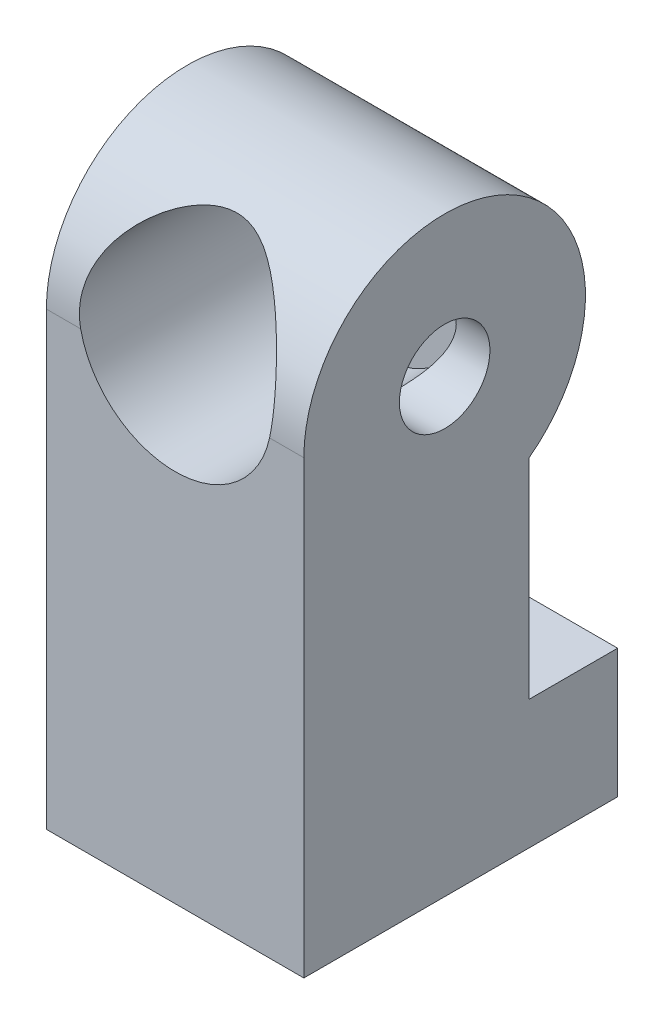
ISO-10303-21;
HEADER;
FILE_DESCRIPTION(('STEP AP214'),'2;1');
FILE_NAME('part.step','',(''),(''),'','','');
FILE_SCHEMA(('AUTOMOTIVE_DESIGN { 1 0 10303 214 1 1 1 1 }'));
ENDSEC;
DATA;
#1=APPLICATION_CONTEXT('core data for automotive mechanical design processes');
#2=APPLICATION_PROTOCOL_DEFINITION('international standard','automotive_design',2000,#1);
#3=PRODUCT_CONTEXT('',#1,'mechanical');
#4=PRODUCT('Part','Part','',(#3));
#5=PRODUCT_RELATED_PRODUCT_CATEGORY('part','',(#4));
#6=PRODUCT_DEFINITION_FORMATION('','',#4);
#7=PRODUCT_DEFINITION_CONTEXT('part definition',#1,'design');
#8=PRODUCT_DEFINITION('design','',#6,#7);
#9=PRODUCT_DEFINITION_SHAPE('','',#8);
#10=(LENGTH_UNIT() NAMED_UNIT(*) SI_UNIT(.MILLI.,.METRE.));
#11=(NAMED_UNIT(*) PLANE_ANGLE_UNIT() SI_UNIT($,.RADIAN.));
#12=(NAMED_UNIT(*) SI_UNIT($,.STERADIAN.) SOLID_ANGLE_UNIT());
#13=UNCERTAINTY_MEASURE_WITH_UNIT(LENGTH_MEASURE(1.E-05),#10,'distance_accuracy_value','');
#14=(GEOMETRIC_REPRESENTATION_CONTEXT(3) GLOBAL_UNCERTAINTY_ASSIGNED_CONTEXT((#13)) GLOBAL_UNIT_ASSIGNED_CONTEXT((#10,
#11,#12)) REPRESENTATION_CONTEXT('',''));
#15=CARTESIAN_POINT('',(0.,0.,0.));
#16=DIRECTION('',(0.,0.,1.));
#17=DIRECTION('',(1.,0.,0.));
#18=AXIS2_PLACEMENT_3D('',#15,#16,#17);
#19=CARTESIAN_POINT('',(-96.,32.,0.));
#20=DIRECTION('',(0.,0.,1.));
#21=DIRECTION('',(0.,-1.,0.));
#22=AXIS2_PLACEMENT_3D('',#19,#20,#21);
#23=PLANE('',#22);
#24=DIRECTION('',(0.,1.,0.));
#25=VECTOR('',#24,1.);
#26=CARTESIAN_POINT('',(-32.,32.,0.));
#27=LINE('',#26,#25);
#28=CARTESIAN_POINT('',(-32.,0.,0.));
#29=VERTEX_POINT('',#28);
#30=CARTESIAN_POINT('',(-32.,32.,0.));
#31=VERTEX_POINT('',#30);
#32=EDGE_CURVE('E172',#29,#31,#27,.T.);
#33=ORIENTED_EDGE('',*,*,#32,.F.);
#34=DIRECTION('',(1.,0.,0.));
#35=VECTOR('',#34,1.);
#36=CARTESIAN_POINT('',(-96.,0.,0.));
#37=LINE('',#36,#35);
#38=CARTESIAN_POINT('',(-96.,0.,0.));
#39=VERTEX_POINT('',#38);
#40=EDGE_CURVE('E186',#39,#29,#37,.T.);
#41=ORIENTED_EDGE('',*,*,#40,.F.);
#42=DIRECTION('',(0.,1.,0.));
#43=VECTOR('',#42,1.);
#44=CARTESIAN_POINT('',(-96.,32.,0.));
#45=LINE('',#44,#43);
#46=CARTESIAN_POINT('',(-96.,32.,0.));
#47=VERTEX_POINT('',#46);
#48=EDGE_CURVE('E185',#39,#47,#45,.T.);
#49=ORIENTED_EDGE('',*,*,#48,.T.);
#50=DIRECTION('',(1.,0.,0.));
#51=VECTOR('',#50,1.);
#52=CARTESIAN_POINT('',(-96.,32.,0.));
#53=LINE('',#52,#51);
#54=EDGE_CURVE('E11',#47,#31,#53,.T.);
#55=ORIENTED_EDGE('',*,*,#54,.T.);
#56=EDGE_LOOP('',(#33,#41,#49,#55));
#57=FACE_BOUND('',#56,.T.);
#58=ADVANCED_FACE('F39',(#57),#23,.F.);
#59=CARTESIAN_POINT('',(-96.,32.,22.));
#60=DIRECTION('',(0.,-1.,0.));
#61=DIRECTION('',(0.,0.,-1.));
#62=AXIS2_PLACEMENT_3D('',#59,#60,#61);
#63=PLANE('',#62);
#64=DIRECTION('',(0.,0.,1.));
#65=VECTOR('',#64,1.);
#66=CARTESIAN_POINT('',(-32.,32.,22.));
#67=LINE('',#66,#65);
#68=CARTESIAN_POINT('',(-32.,32.,22.));
#69=VERTEX_POINT('',#68);
#70=EDGE_CURVE('E161',#31,#69,#67,.T.);
#71=ORIENTED_EDGE('',*,*,#70,.F.);
#72=ORIENTED_EDGE('',*,*,#54,.F.);
#73=DIRECTION('',(0.,0.,1.));
#74=VECTOR('',#73,1.);
#75=CARTESIAN_POINT('',(-96.,32.,22.));
#76=LINE('',#75,#74);
#77=CARTESIAN_POINT('',(-96.,32.,22.));
#78=VERTEX_POINT('',#77);
#79=EDGE_CURVE('E162',#47,#78,#76,.T.);
#80=ORIENTED_EDGE('',*,*,#79,.T.);
#81=DIRECTION('',(1.,0.,0.));
#82=VECTOR('',#81,1.);
#83=CARTESIAN_POINT('',(-96.,32.,22.));
#84=LINE('',#83,#82);
#85=EDGE_CURVE('E52',#78,#69,#84,.T.);
#86=ORIENTED_EDGE('',*,*,#85,.T.);
#87=EDGE_LOOP('',(#71,#72,#80,#86));
#88=FACE_BOUND('',#87,.T.);
#89=ADVANCED_FACE('F159',(#88),#63,.F.);
#90=CARTESIAN_POINT('',(-96.,83.9999999999999,22.));
#91=DIRECTION('',(0.,0.,1.));
#92=DIRECTION('',(0.,-1.,0.));
#93=AXIS2_PLACEMENT_3D('',#90,#91,#92);
#94=PLANE('',#93);
#95=DIRECTION('',(0.,1.,0.));
#96=VECTOR('',#95,1.);
#97=CARTESIAN_POINT('',(-32.,83.9999999999999,22.));
#98=LINE('',#97,#96);
#99=CARTESIAN_POINT('',(-32.,83.9999999999999,22.));
#100=VERTEX_POINT('',#99);
#101=EDGE_CURVE('E170',#69,#100,#98,.T.);
#102=ORIENTED_EDGE('',*,*,#101,.F.);
#103=ORIENTED_EDGE('',*,*,#85,.F.);
#104=DIRECTION('',(0.,1.,0.));
#105=VECTOR('',#104,1.);
#106=CARTESIAN_POINT('',(-96.,83.9999999999999,22.));
#107=LINE('',#106,#105);
#108=CARTESIAN_POINT('',(-96.,83.9999999999999,22.));
#109=VERTEX_POINT('',#108);
#110=EDGE_CURVE('E198',#78,#109,#107,.T.);
#111=ORIENTED_EDGE('',*,*,#110,.T.);
#112=DIRECTION('',(1.,0.,0.));
#113=VECTOR('',#112,1.);
#114=CARTESIAN_POINT('',(-96.,83.9999999999999,22.));
#115=LINE('',#114,#113);
#116=EDGE_CURVE('E146',#109,#100,#115,.T.);
#117=ORIENTED_EDGE('',*,*,#116,.T.);
#118=EDGE_LOOP('',(#102,#103,#111,#117));
#119=FACE_BOUND('',#118,.T.);
#120=ADVANCED_FACE('F241',(#119),#94,.F.);
#121=CARTESIAN_POINT('',(-96.,112.,43.));
#122=DIRECTION('',(1.,0.,0.));
#123=DIRECTION('',(0.,0.,1.));
#124=AXIS2_PLACEMENT_3D('',#121,#122,#123);
#125=CYLINDRICAL_SURFACE('',#124,35.);
#126=DIRECTION('',(1.,0.,0.));
#127=VECTOR('',#126,1.);
#128=CARTESIAN_POINT('',(-96.,112.,78.));
#129=LINE('',#128,#127);
#130=CARTESIAN_POINT('',(-40.526610811389,112.,78.));
#131=VERTEX_POINT('',#130);
#132=CARTESIAN_POINT('',(-32.,112.,78.));
#133=VERTEX_POINT('',#132);
#134=EDGE_CURVE('E135',#131,#133,#129,.T.);
#135=ORIENTED_EDGE('',*,*,#134,.T.);
#136=CARTESIAN_POINT('',(-32.,112.,43.));
#137=DIRECTION('',(1.,0.,0.));
#138=DIRECTION('',(0.,0.,-1.));
#139=AXIS2_PLACEMENT_3D('',#136,#137,#138);
#140=CIRCLE('',#139,35.);
#141=EDGE_CURVE('E174',#100,#133,#140,.T.);
#142=ORIENTED_EDGE('',*,*,#141,.F.);
#143=ORIENTED_EDGE('',*,*,#116,.F.);
#144=CARTESIAN_POINT('',(-96.,112.,43.));
#145=DIRECTION('',(1.,0.,0.));
#146=DIRECTION('',(0.,0.,-1.));
#147=AXIS2_PLACEMENT_3D('',#144,#145,#146);
#148=CIRCLE('',#147,35.);
#149=CARTESIAN_POINT('',(-96.,112.,78.));
#150=VERTEX_POINT('',#149);
#151=EDGE_CURVE('E145',#109,#150,#148,.T.);
#152=ORIENTED_EDGE('',*,*,#151,.T.);
#153=CARTESIAN_POINT('',(-87.473389188611,112.,78.));
#154=VERTEX_POINT('',#153);
#155=EDGE_CURVE('E132',#150,#154,#129,.T.);
#156=ORIENTED_EDGE('',*,*,#155,.T.);
#157=CARTESIAN_POINT('',(-40.526610811389,112.,78.));
#158=CARTESIAN_POINT('',(-40.4657372784238,112.285770960589,78.0000033038681));
#159=CARTESIAN_POINT('',(-40.4100954867292,112.5726193664,77.9964988963329));
#160=CARTESIAN_POINT('',(-40.3093425981942,113.147980595281,77.9823517356442));
#161=CARTESIAN_POINT('',(-40.2642313709705,113.436493397699,77.9717090708787));
#162=CARTESIAN_POINT('',(-40.1448318755622,114.303515876569,77.9289033771368));
#163=CARTESIAN_POINT('',(-40.0864171322367,114.883794772241,77.8858628929673));
#164=CARTESIAN_POINT('',(-40.0121992504889,116.040907567426,77.7707843532183));
#165=CARTESIAN_POINT('',(-39.9961661951566,116.617743046204,77.6989052047706));
#166=CARTESIAN_POINT('',(-40.0053741544142,117.766797193259,77.5265332121475));
#167=CARTESIAN_POINT('',(-40.0306153202229,118.339015844612,77.4260402631392));
#168=CARTESIAN_POINT('',(-40.1210935752478,119.474255506463,77.1975237261499));
#169=CARTESIAN_POINT('',(-40.1863031680125,120.037282567213,77.0695191042202));
#170=CARTESIAN_POINT('',(-40.3549941694054,121.151009412165,76.7874084626899));
#171=CARTESIAN_POINT('',(-40.4584792312914,121.701708014336,76.633299952327));
#172=CARTESIAN_POINT('',(-40.6408771360302,122.516248586096,76.3839691258425));
#173=CARTESIAN_POINT('',(-40.7062520129752,122.786001926171,76.2977739075156));
#174=CARTESIAN_POINT('',(-40.8457653383859,123.321223515012,76.1196227842082));
#175=CARTESIAN_POINT('',(-40.9199014077309,123.586692904939,76.0276684463025));
#176=CARTESIAN_POINT('',(-41.1550726165188,124.376377774185,75.7435209405201));
#177=CARTESIAN_POINT('',(-41.3288741102407,124.893884826216,75.5430387086922));
#178=CARTESIAN_POINT('',(-41.7187816109087,125.937267228196,75.1105786862499));
#179=CARTESIAN_POINT('',(-41.9367138872053,126.461983388682,74.8774649639629));
#180=CARTESIAN_POINT('',(-42.4052638440613,127.487379798758,74.3920825661714));
#181=CARTESIAN_POINT('',(-42.6558825982168,127.988059258118,74.1398132616106));
#182=CARTESIAN_POINT('',(-43.1874007239557,128.96430966045,73.6189220126708));
#183=CARTESIAN_POINT('',(-43.4683065287994,129.439875236908,73.3502965993925));
#184=CARTESIAN_POINT('',(-44.0582026419268,130.365095991676,72.7995499119513));
#185=CARTESIAN_POINT('',(-44.367196680949,130.814747715056,72.517426847366));
#186=CARTESIAN_POINT('',(-45.0769932392409,131.776539777435,71.8839756846293));
#187=CARTESIAN_POINT('',(-45.483680401591,132.282767496524,71.5302507278996));
#188=CARTESIAN_POINT('',(-46.3325138297209,133.256607895729,70.8122757689805));
#189=CARTESIAN_POINT('',(-46.774665724245,133.724214422128,70.4480241019484));
#190=CARTESIAN_POINT('',(-47.6932326691756,134.621064184179,69.7137360772324));
#191=CARTESIAN_POINT('',(-48.1696892860173,135.050259416332,69.3436931419473));
#192=CARTESIAN_POINT('',(-49.1554468038176,135.869284514985,68.6039381547479));
#193=CARTESIAN_POINT('',(-49.6647440681305,136.259118727945,68.2342260707776));
#194=CARTESIAN_POINT('',(-50.6789248567714,136.972621388621,67.5275778642149));
#195=CARTESIAN_POINT('',(-51.1815613925863,137.29902133158,67.1901763352173));
#196=CARTESIAN_POINT('',(-52.2159222054699,137.916463461873,66.5274736222862));
#197=CARTESIAN_POINT('',(-52.7476515437851,138.20749946843,66.20217456045));
#198=CARTESIAN_POINT('',(-53.8404443557964,138.752136982544,65.5720202239907));
#199=CARTESIAN_POINT('',(-54.4014579451167,139.005799506232,65.2671320806778));
#200=CARTESIAN_POINT('',(-55.2660787074933,139.356547270904,64.8324101920279));
#201=CARTESIAN_POINT('',(-55.5580734989057,139.468485631767,64.691297882064));
#202=CARTESIAN_POINT('',(-56.1500208382346,139.682082580426,64.4180378337826));
#203=CARTESIAN_POINT('',(-56.4499749914042,139.783739074363,64.2858919232302));
#204=CARTESIAN_POINT('',(-57.1383054925486,140.001733104963,63.9986545453286));
#205=CARTESIAN_POINT('',(-57.5290609155852,140.114828666823,63.8467547918406));
#206=CARTESIAN_POINT('',(-58.3227618099813,140.322460110087,63.5637805282619));
#207=CARTESIAN_POINT('',(-58.725703087113,140.417002295297,63.4326989477616));
#208=CARTESIAN_POINT('',(-59.5422707526879,140.586057898427,63.1955071240069));
#209=CARTESIAN_POINT('',(-59.9558771060737,140.660606243383,63.0893533754916));
#210=CARTESIAN_POINT('',(-60.7926945485433,140.788490554708,62.9056622776807));
#211=CARTESIAN_POINT('',(-61.2159054669494,140.841826897714,62.8281244202894));
#212=CARTESIAN_POINT('',(-62.0738991132862,140.926510726852,62.7043833440177));
#213=CARTESIAN_POINT('',(-62.5087577358442,140.957611765854,62.6585315007774));
#214=CARTESIAN_POINT('',(-63.3818048857427,140.996014519876,62.6018454756325));
#215=CARTESIAN_POINT('',(-63.8199931944765,141.003317784008,62.5910090144081));
#216=CARTESIAN_POINT('',(-64.6956402729745,140.99391257502,62.6049253497456));
#217=CARTESIAN_POINT('',(-65.1330988510211,140.977198559646,62.6296863608181));
#218=CARTESIAN_POINT('',(-66.0031545130957,140.920232633042,62.7135145958411));
#219=CARTESIAN_POINT('',(-66.4357510175502,140.879977945398,62.7725858663779));
#220=CARTESIAN_POINT('',(-67.332186578583,140.772225362011,62.9290956909359));
#221=CARTESIAN_POINT('',(-67.7952304203971,140.702558517586,63.0295686153942));
#222=CARTESIAN_POINT('',(-68.7084054317072,140.538188484801,63.2630719360726));
#223=CARTESIAN_POINT('',(-69.1585346393955,140.443481514789,63.3961072497592));
#224=CARTESIAN_POINT('',(-70.0451623198209,140.230678101119,63.6896522272234));
#225=CARTESIAN_POINT('',(-70.4816265313219,140.112527589649,63.8502252828761));
#226=CARTESIAN_POINT('',(-71.3393193493604,139.854650429306,64.1935017709339));
#227=CARTESIAN_POINT('',(-71.760542061645,139.714915541017,64.3762136486396));
#228=CARTESIAN_POINT('',(-72.4983285470345,139.447658815825,64.7177897269317));
#229=CARTESIAN_POINT('',(-72.8178715531162,139.324002553949,64.8732985801746));
#230=CARTESIAN_POINT('',(-73.447519774892,139.064909120625,65.1930864183557));
#231=CARTESIAN_POINT('',(-73.7576271200682,138.929474634362,65.3573634010649));
#232=CARTESIAN_POINT('',(-74.674572733812,138.505982825757,65.8609913881334));
#233=CARTESIAN_POINT('',(-75.2677626094386,138.200836585416,66.2110103800378));
#234=CARTESIAN_POINT('',(-76.4196710003238,137.547283009352,66.9284860072909));
#235=CARTESIAN_POINT('',(-76.9783441636001,137.19882049637,67.2959645073313));
#236=CARTESIAN_POINT('',(-78.0614134952924,136.46037144984,68.0392628190313));
#237=CARTESIAN_POINT('',(-78.5858160594052,136.070392700114,68.4150810566626));
#238=CARTESIAN_POINT('',(-79.6284891559248,135.227020668909,69.1887524129456));
#239=CARTESIAN_POINT('',(-80.1448388827189,134.771320166758,69.5866814386049));
#240=CARTESIAN_POINT('',(-81.138747156398,133.814846148549,70.3769523658219));
#241=CARTESIAN_POINT('',(-81.6163013968348,133.31406764163,70.7692936431425));
#242=CARTESIAN_POINT('',(-82.5299365302564,132.268356030928,71.5414694722964));
#243=CARTESIAN_POINT('',(-82.9660710341274,131.723481742473,71.9213197632747));
#244=CARTESIAN_POINT('',(-83.5871022200298,130.873303088104,72.4773333434011));
#245=CARTESIAN_POINT('',(-83.7885753251226,130.584446965526,72.6603691174928));
#246=CARTESIAN_POINT('',(-84.1800718120861,129.995757059943,73.0211914641386));
#247=CARTESIAN_POINT('',(-84.3700922763467,129.69592051064,73.1989766932598));
#248=CARTESIAN_POINT('',(-84.863517109877,128.877407023356,73.667618227553));
#249=CARTESIAN_POINT('',(-85.1559380025174,128.348848524768,73.9529605442081));
#250=CARTESIAN_POINT('',(-85.7036715809497,127.262580543549,74.5027641915182));
#251=CARTESIAN_POINT('',(-85.9589915637228,126.704876822597,74.7672296235381));
#252=CARTESIAN_POINT('',(-86.4293197889321,125.56197335087,75.2717052619744));
#253=CARTESIAN_POINT('',(-86.6443280614472,124.97677362061,75.5117154866381));
#254=CARTESIAN_POINT('',(-87.0305278996039,123.781530243429,75.9636721775861));
#255=CARTESIAN_POINT('',(-87.2017205543213,123.171487214446,76.1756193413392));
#256=CARTESIAN_POINT('',(-87.4981658192128,121.924487052425,76.5698666708576));
#257=CARTESIAN_POINT('',(-87.6229869622794,121.287335765034,76.7518800192127));
#258=CARTESIAN_POINT('',(-87.8212183126255,119.996027867703,77.080894813519));
#259=CARTESIAN_POINT('',(-87.8946213439663,119.341868897368,77.2278913706199));
#260=CARTESIAN_POINT('',(-87.9872475998921,118.023636644477,77.4842855905155));
#261=CARTESIAN_POINT('',(-88.006566661784,117.359582998009,77.5937494590501));
#262=CARTESIAN_POINT('',(-87.9895161648737,116.027200903242,77.774026119515));
#263=CARTESIAN_POINT('',(-87.9531837011113,115.358875597896,77.8448646148769));
#264=CARTESIAN_POINT('',(-87.8669590475495,114.466247883746,77.9137385262532));
#265=CARTESIAN_POINT('',(-87.8419218941916,114.240577618303,77.9289399760838));
#266=CARTESIAN_POINT('',(-87.7854236388511,113.789836340084,77.9549334380612));
#267=CARTESIAN_POINT('',(-87.7539644501736,113.564765169005,77.9657267606462));
#268=CARTESIAN_POINT('',(-87.6846878989832,113.11579063128,77.9829302721798));
#269=CARTESIAN_POINT('',(-87.6468802493292,112.891886011397,77.9893470822089));
#270=CARTESIAN_POINT('',(-87.5648993582725,112.445096829355,77.9978837310614));
#271=CARTESIAN_POINT('',(-87.5207243093025,112.222212575456,78.0000023471372));
#272=CARTESIAN_POINT('',(-87.473389188611,112.,78.));
#273=B_SPLINE_CURVE_WITH_KNOTS('',3,(#157,#158,#159,#160,#161,#162,#163,#164,#165,#166,#167,
#168,#169,#170,#171,#172,#173,#174,#175,#176,#177,#178,#179,#180,#181,#182,#183,#184,#185,#186,
#187,#188,#189,#190,#191,#192,#193,#194,#195,#196,#197,#198,#199,#200,#201,#202,#203,#204,#205,
#206,#207,#208,#209,#210,#211,#212,#213,#214,#215,#216,#217,#218,#219,#220,#221,#222,#223,#224,
#225,#226,#227,#228,#229,#230,#231,#232,#233,#234,#235,#236,#237,#238,#239,#240,#241,#242,#243,
#244,#245,#246,#247,#248,#249,#250,#251,#252,#253,#254,#255,#256,#257,#258,#259,#260,#261,#262,
#263,#264,#265,#266,#267,#268,#269,#270,#271,#272),.UNSPECIFIED.,.F.,.F.,(4,2,2,2,2,2,2,2,2,2,2,
2,2,2,2,2,2,2,2,2,2,2,2,2,2,2,2,2,2,2,2,2,2,2,2,2,2,2,2,2,2,2,2,2,2,2,2,2,2,2,2,2,2,2,2,2,2,4),
(0.,0.876403966798758,1.7527970819047,3.50471179155132,5.24710282627611,6.98950024471845,
8.73070031669074,10.4720666229363,11.3437919347099,12.2152810691987,13.9582117154247,
15.7989189333481,17.6396866250204,19.4808460865825,21.3222504531546,23.5385022533195,
25.7551065020237,27.9744433000831,30.1935347580644,32.2552997633313,34.317424599445,
36.3761445802565,37.4050830114413,38.4342305614219,39.7359347299754,41.0371958551063,
42.3361687916078,43.6351186627954,44.9482513076796,46.2612984727175,47.5746486865534,
48.8881538296864,50.3227193215866,51.7575015907295,53.1956321853617,54.6343131213943,
55.7627137920535,56.8908578823379,59.1480937944034,61.4082350700789,63.6679533387697,
66.051857854531,68.4360266323193,70.8170662016702,72.0074718786877,73.1981795459368,
75.2003632863393,77.2021527040928,79.2039406281991,81.205678791273,83.225601604364,
85.245806262813,87.2624288266118,89.2777077767934,89.9603102167158,90.6427095861677,
91.3240742725771,92.0056327660513),.UNSPECIFIED.);
#274=EDGE_CURVE('E138',#131,#154,#273,.T.);
#275=ORIENTED_EDGE('',*,*,#274,.F.);
#276=EDGE_LOOP('',(#135,#142,#143,#152,#156,#275));
#277=FACE_BOUND('',#276,.T.);
#278=ADVANCED_FACE('F143',(#277),#125,.T.);
#279=CARTESIAN_POINT('',(-96.,0.,78.));
#280=DIRECTION('',(0.,0.,-1.));
#281=DIRECTION('',(1.,0.,0.));
#282=AXIS2_PLACEMENT_3D('',#279,#280,#281);
#283=PLANE('',#282);
#284=ORIENTED_EDGE('',*,*,#155,.F.);
#285=DIRECTION('',(0.,-1.,0.));
#286=VECTOR('',#285,1.);
#287=CARTESIAN_POINT('',(-96.,0.,78.));
#288=LINE('',#287,#286);
#289=CARTESIAN_POINT('',(-96.,0.,78.));
#290=VERTEX_POINT('',#289);
#291=EDGE_CURVE('E192',#150,#290,#288,.T.);
#292=ORIENTED_EDGE('',*,*,#291,.T.);
#293=DIRECTION('',(1.,0.,0.));
#294=VECTOR('',#293,1.);
#295=CARTESIAN_POINT('',(-96.,0.,78.));
#296=LINE('',#295,#294);
#297=CARTESIAN_POINT('',(-32.,0.,78.));
#298=VERTEX_POINT('',#297);
#299=EDGE_CURVE('E150',#290,#298,#296,.T.);
#300=ORIENTED_EDGE('',*,*,#299,.T.);
#301=DIRECTION('',(0.,-1.,0.));
#302=VECTOR('',#301,1.);
#303=CARTESIAN_POINT('',(-32.,0.,78.));
#304=LINE('',#303,#302);
#305=EDGE_CURVE('E181',#133,#298,#304,.T.);
#306=ORIENTED_EDGE('',*,*,#305,.F.);
#307=ORIENTED_EDGE('',*,*,#134,.F.);
#308=CARTESIAN_POINT('',(-64.,117.,78.));
#309=DIRECTION('',(0.,0.,-1.));
#310=DIRECTION('',(-1.,0.,0.));
#311=AXIS2_PLACEMENT_3D('',#308,#309,#310);
#312=CIRCLE('',#311,24.);
#313=EDGE_CURVE('E58',#131,#154,#312,.T.);
#314=ORIENTED_EDGE('',*,*,#313,.T.);
#315=EDGE_LOOP('',(#284,#292,#300,#306,#307,#314));
#316=FACE_BOUND('',#315,.T.);
#317=ADVANCED_FACE('F129',(#316),#283,.F.);
#318=CARTESIAN_POINT('',(-96.,0.,0.));
#319=DIRECTION('',(0.,1.,0.));
#320=DIRECTION('',(0.,0.,1.));
#321=AXIS2_PLACEMENT_3D('',#318,#319,#320);
#322=PLANE('',#321);
#323=DIRECTION('',(1.,0.,0.));
#324=VECTOR('',#323,1.);
#325=CARTESIAN_POINT('',(-40.,0.,64.));
#326=LINE('',#325,#324);
#327=CARTESIAN_POINT('',(-88.,0.,64.));
#328=VERTEX_POINT('',#327);
#329=CARTESIAN_POINT('',(-40.,0.,64.));
#330=VERTEX_POINT('',#329);
#331=EDGE_CURVE('E217',#328,#330,#326,.T.);
#332=ORIENTED_EDGE('',*,*,#331,.T.);
#333=DIRECTION('',(0.,0.,-1.));
#334=VECTOR('',#333,1.);
#335=CARTESIAN_POINT('',(-40.,0.,31.));
#336=LINE('',#335,#334);
#337=CARTESIAN_POINT('',(-40.,0.,31.));
#338=VERTEX_POINT('',#337);
#339=EDGE_CURVE('E214',#330,#338,#336,.T.);
#340=ORIENTED_EDGE('',*,*,#339,.T.);
#341=DIRECTION('',(-1.,0.,0.));
#342=VECTOR('',#341,1.);
#343=CARTESIAN_POINT('',(-40.,0.,31.));
#344=LINE('',#343,#342);
#345=CARTESIAN_POINT('',(-88.,0.,31.));
#346=VERTEX_POINT('',#345);
#347=EDGE_CURVE('E210',#338,#346,#344,.T.);
#348=ORIENTED_EDGE('',*,*,#347,.T.);
#349=DIRECTION('',(0.,0.,1.));
#350=VECTOR('',#349,1.);
#351=CARTESIAN_POINT('',(-88.,0.,31.));
#352=LINE('',#351,#350);
#353=EDGE_CURVE('E220',#346,#328,#352,.T.);
#354=ORIENTED_EDGE('',*,*,#353,.T.);
#355=EDGE_LOOP('',(#332,#340,#348,#354));
#356=FACE_BOUND('',#355,.T.);
#357=DIRECTION('',(0.,0.,-1.));
#358=VECTOR('',#357,1.);
#359=CARTESIAN_POINT('',(-32.,0.,0.));
#360=LINE('',#359,#358);
#361=EDGE_CURVE('E184',#298,#29,#360,.T.);
#362=ORIENTED_EDGE('',*,*,#361,.F.);
#363=ORIENTED_EDGE('',*,*,#299,.F.);
#364=DIRECTION('',(0.,0.,-1.));
#365=VECTOR('',#364,1.);
#366=CARTESIAN_POINT('',(-96.,0.,0.));
#367=LINE('',#366,#365);
#368=EDGE_CURVE('E188',#290,#39,#367,.T.);
#369=ORIENTED_EDGE('',*,*,#368,.T.);
#370=ORIENTED_EDGE('',*,*,#40,.T.);
#371=EDGE_LOOP('',(#362,#363,#369,#370));
#372=FACE_BOUND('',#371,.T.);
#373=ADVANCED_FACE('F253',(#356,#372),#322,.F.);
#374=CARTESIAN_POINT('',(-96.,112.,43.));
#375=DIRECTION('',(-1.,0.,0.));
#376=DIRECTION('',(0.,0.,-1.));
#377=AXIS2_PLACEMENT_3D('',#374,#375,#376);
#378=PLANE('',#377);
#379=ORIENTED_EDGE('',*,*,#48,.F.);
#380=ORIENTED_EDGE('',*,*,#368,.F.);
#381=ORIENTED_EDGE('',*,*,#291,.F.);
#382=ORIENTED_EDGE('',*,*,#151,.F.);
#383=ORIENTED_EDGE('',*,*,#110,.F.);
#384=ORIENTED_EDGE('',*,*,#79,.F.);
#385=EDGE_LOOP('',(#379,#380,#381,#382,#383,#384));
#386=FACE_BOUND('',#385,.T.);
#387=ADVANCED_FACE('F252',(#386),#378,.T.);
#388=CARTESIAN_POINT('',(-32.,112.,43.));
#389=DIRECTION('',(-1.,0.,0.));
#390=DIRECTION('',(0.,0.,-1.));
#391=AXIS2_PLACEMENT_3D('',#388,#389,#390);
#392=PLANE('',#391);
#393=CARTESIAN_POINT('',(-32.,112.,43.));
#394=DIRECTION('',(-1.,0.,0.));
#395=DIRECTION('',(0.,0.,1.));
#396=AXIS2_PLACEMENT_3D('',#393,#394,#395);
#397=CIRCLE('',#396,11.25);
#398=CARTESIAN_POINT('',(-32.,112.,54.25));
#399=VERTEX_POINT('',#398);
#400=EDGE_CURVE('E141',#399,#399,#397,.T.);
#401=ORIENTED_EDGE('',*,*,#400,.T.);
#402=EDGE_LOOP('',(#401));
#403=FACE_BOUND('',#402,.T.);
#404=ORIENTED_EDGE('',*,*,#32,.T.);
#405=ORIENTED_EDGE('',*,*,#70,.T.);
#406=ORIENTED_EDGE('',*,*,#101,.T.);
#407=ORIENTED_EDGE('',*,*,#141,.T.);
#408=ORIENTED_EDGE('',*,*,#305,.T.);
#409=ORIENTED_EDGE('',*,*,#361,.T.);
#410=EDGE_LOOP('',(#404,#405,#406,#407,#408,#409));
#411=FACE_BOUND('',#410,.T.);
#412=ADVANCED_FACE('F168',(#403,#411),#392,.F.);
#413=CARTESIAN_POINT('',(-88.,89.,31.));
#414=DIRECTION('',(-1.,0.,0.));
#415=DIRECTION('',(0.,0.,-1.));
#416=AXIS2_PLACEMENT_3D('',#413,#414,#415);
#417=PLANE('',#416);
#418=ORIENTED_EDGE('',*,*,#353,.F.);
#419=DIRECTION('',(0.,-1.,0.));
#420=VECTOR('',#419,1.);
#421=CARTESIAN_POINT('',(-88.,89.,31.));
#422=LINE('',#421,#420);
#423=CARTESIAN_POINT('',(-88.,89.,31.));
#424=VERTEX_POINT('',#423);
#425=EDGE_CURVE('E176',#424,#346,#422,.T.);
#426=ORIENTED_EDGE('',*,*,#425,.F.);
#427=DIRECTION('',(0.,0.,1.));
#428=VECTOR('',#427,1.);
#429=CARTESIAN_POINT('',(-88.,89.,31.));
#430=LINE('',#429,#428);
#431=CARTESIAN_POINT('',(-88.,89.,64.));
#432=VERTEX_POINT('',#431);
#433=EDGE_CURVE('E213',#424,#432,#430,.T.);
#434=ORIENTED_EDGE('',*,*,#433,.T.);
#435=DIRECTION('',(0.,-1.,0.));
#436=VECTOR('',#435,1.);
#437=CARTESIAN_POINT('',(-88.,89.,64.));
#438=LINE('',#437,#436);
#439=EDGE_CURVE('E66',#432,#328,#438,.T.);
#440=ORIENTED_EDGE('',*,*,#439,.T.);
#441=EDGE_LOOP('',(#418,#426,#434,#440));
#442=FACE_BOUND('',#441,.T.);
#443=ADVANCED_FACE('F263',(#442),#417,.F.);
#444=CARTESIAN_POINT('',(-40.,89.,31.));
#445=DIRECTION('',(0.,0.,-1.));
#446=DIRECTION('',(1.,0.,0.));
#447=AXIS2_PLACEMENT_3D('',#444,#445,#446);
#448=PLANE('',#447);
#449=ORIENTED_EDGE('',*,*,#347,.F.);
#450=DIRECTION('',(0.,-1.,0.));
#451=VECTOR('',#450,1.);
#452=CARTESIAN_POINT('',(-40.,89.,31.));
#453=LINE('',#452,#451);
#454=CARTESIAN_POINT('',(-40.,89.,31.));
#455=VERTEX_POINT('',#454);
#456=EDGE_CURVE('E207',#455,#338,#453,.T.);
#457=ORIENTED_EDGE('',*,*,#456,.F.);
#458=DIRECTION('',(-1.,0.,0.));
#459=VECTOR('',#458,1.);
#460=CARTESIAN_POINT('',(-40.,89.,31.));
#461=LINE('',#460,#459);
#462=EDGE_CURVE('E205',#455,#424,#461,.T.);
#463=ORIENTED_EDGE('',*,*,#462,.T.);
#464=ORIENTED_EDGE('',*,*,#425,.T.);
#465=EDGE_LOOP('',(#449,#457,#463,#464));
#466=FACE_BOUND('',#465,.T.);
#467=ADVANCED_FACE('F268',(#466),#448,.F.);
#468=CARTESIAN_POINT('',(-40.,89.,31.));
#469=DIRECTION('',(1.,0.,0.));
#470=DIRECTION('',(0.,0.,1.));
#471=AXIS2_PLACEMENT_3D('',#468,#469,#470);
#472=PLANE('',#471);
#473=ORIENTED_EDGE('',*,*,#339,.F.);
#474=DIRECTION('',(0.,-1.,0.));
#475=VECTOR('',#474,1.);
#476=CARTESIAN_POINT('',(-40.,89.,64.));
#477=LINE('',#476,#475);
#478=CARTESIAN_POINT('',(-40.,89.,64.));
#479=VERTEX_POINT('',#478);
#480=EDGE_CURVE('E204',#479,#330,#477,.T.);
#481=ORIENTED_EDGE('',*,*,#480,.F.);
#482=DIRECTION('',(0.,0.,-1.));
#483=VECTOR('',#482,1.);
#484=CARTESIAN_POINT('',(-40.,89.,31.));
#485=LINE('',#484,#483);
#486=EDGE_CURVE('E223',#479,#455,#485,.T.);
#487=ORIENTED_EDGE('',*,*,#486,.T.);
#488=ORIENTED_EDGE('',*,*,#456,.T.);
#489=EDGE_LOOP('',(#473,#481,#487,#488));
#490=FACE_BOUND('',#489,.T.);
#491=ADVANCED_FACE('F273',(#490),#472,.F.);
#492=CARTESIAN_POINT('',(-40.,89.,64.));
#493=DIRECTION('',(0.,0.,1.));
#494=DIRECTION('',(-1.,0.,0.));
#495=AXIS2_PLACEMENT_3D('',#492,#493,#494);
#496=PLANE('',#495);
#497=ORIENTED_EDGE('',*,*,#331,.F.);
#498=ORIENTED_EDGE('',*,*,#439,.F.);
#499=DIRECTION('',(1.,0.,0.));
#500=VECTOR('',#499,1.);
#501=CARTESIAN_POINT('',(-40.,89.,64.));
#502=LINE('',#501,#500);
#503=EDGE_CURVE('E225',#432,#479,#502,.T.);
#504=ORIENTED_EDGE('',*,*,#503,.T.);
#505=ORIENTED_EDGE('',*,*,#480,.T.);
#506=EDGE_LOOP('',(#497,#498,#504,#505));
#507=FACE_BOUND('',#506,.T.);
#508=ADVANCED_FACE('F269',(#507),#496,.F.);
#509=CARTESIAN_POINT('',(-64.,89.,0.));
#510=DIRECTION('',(0.,1.,0.));
#511=DIRECTION('',(0.,0.,1.));
#512=AXIS2_PLACEMENT_3D('',#509,#510,#511);
#513=PLANE('',#512);
#514=ORIENTED_EDGE('',*,*,#433,.F.);
#515=ORIENTED_EDGE('',*,*,#462,.F.);
#516=ORIENTED_EDGE('',*,*,#486,.F.);
#517=ORIENTED_EDGE('',*,*,#503,.F.);
#518=EDGE_LOOP('',(#514,#515,#516,#517));
#519=FACE_BOUND('',#518,.T.);
#520=ADVANCED_FACE('F272',(#519),#513,.F.);
#521=CARTESIAN_POINT('',(-52.,112.,43.));
#522=DIRECTION('',(1.,0.,0.));
#523=DIRECTION('',(0.,0.,1.));
#524=AXIS2_PLACEMENT_3D('',#521,#522,#523);
#525=CYLINDRICAL_SURFACE('',#524,11.25);
#526=CARTESIAN_POINT('',(-40.526610811389,112.,54.25));
#527=CARTESIAN_POINT('',(-40.5942947321078,111.682242896057,54.2500008223099));
#528=CARTESIAN_POINT('',(-40.6684434837552,111.365880355509,54.2365248166985));
#529=CARTESIAN_POINT('',(-40.8289646481728,110.738366218302,54.1834689159661));
#530=CARTESIAN_POINT('',(-40.9153422904097,110.427216914983,54.1438778265535));
#531=CARTESIAN_POINT('',(-41.0994248907778,109.81202863859,54.0396008523921));
#532=CARTESIAN_POINT('',(-41.1971481569133,109.508002136476,53.9748740011071));
#533=CARTESIAN_POINT('',(-41.4025787151349,108.90946918833,53.8215792332269));
#534=CARTESIAN_POINT('',(-41.510287214572,108.614963899364,53.7330084311008));
#535=CARTESIAN_POINT('',(-41.7335861244171,108.038880048384,53.5339611390309));
#536=CARTESIAN_POINT('',(-41.8491236225079,107.757232757932,53.4236236297934));
#537=CARTESIAN_POINT('',(-42.0871895682074,107.206183914864,53.1819620636799));
#538=CARTESIAN_POINT('',(-42.2097181152786,106.93678253657,53.0506377081735));
#539=CARTESIAN_POINT('',(-42.4602102333798,106.411222627812,52.7681666458476));
#540=CARTESIAN_POINT('',(-42.5881741184971,106.155064864547,52.6170187924478));
#541=CARTESIAN_POINT('',(-42.8478969780299,105.65683119884,52.2959429648363));
#542=CARTESIAN_POINT('',(-42.979656186961,105.414756169381,52.1260138282683));
#543=CARTESIAN_POINT('',(-43.2597166701451,104.919849719836,51.7487739365798));
#544=CARTESIAN_POINT('',(-43.4082568444941,104.668717646219,51.5394075494103));
#545=CARTESIAN_POINT('',(-43.7053924365991,104.185580436827,51.0996342934338));
#546=CARTESIAN_POINT('',(-43.8539878590685,103.953577841662,50.8692246383819));
#547=CARTESIAN_POINT('',(-44.1484987626029,103.509675493538,50.3881017902632));
#548=CARTESIAN_POINT('',(-44.2944137446559,103.297779453795,50.1373848626996));
#549=CARTESIAN_POINT('',(-44.5804483854243,102.895322361145,49.6163192579361));
#550=CARTESIAN_POINT('',(-44.7205692194197,102.70475696803,49.3459745929724));
#551=CARTESIAN_POINT('',(-44.9675248694681,102.378129829239,48.8358272380565));
#552=CARTESIAN_POINT('',(-45.0758589484227,102.238393161436,48.5990982898353));
#553=CARTESIAN_POINT('',(-45.284068942888,101.97528494988,48.1131127853312));
#554=CARTESIAN_POINT('',(-45.3839451774055,101.851912788804,47.8638567021031));
#555=CARTESIAN_POINT('',(-45.5726971004443,101.622857503953,47.3537864694761));
#556=CARTESIAN_POINT('',(-45.6615886375021,101.517148816136,47.0929897268971));
#557=CARTESIAN_POINT('',(-45.8259685403526,101.324521332035,46.5604459657223));
#558=CARTESIAN_POINT('',(-45.9014596089219,101.23759874596,46.2887011688663));
#559=CARTESIAN_POINT('',(-46.024537744886,101.097489154198,45.7845306678099));
#560=CARTESIAN_POINT('',(-46.0746982017179,101.041055531338,45.5536328596746));
#561=CARTESIAN_POINT('',(-46.1628322668972,100.942608434672,45.0865123588966));
#562=CARTESIAN_POINT('',(-46.2008083281589,100.900592058325,44.8502907482818));
#563=CARTESIAN_POINT('',(-46.2634202061293,100.831638475472,44.3740608198114));
#564=CARTESIAN_POINT('',(-46.2880651553836,100.804690945549,44.1340552104954));
#565=CARTESIAN_POINT('',(-46.323253064875,100.766291155118,43.65176562917));
#566=CARTESIAN_POINT('',(-46.333795922061,100.754839007843,43.4094816405244));
#567=CARTESIAN_POINT('',(-46.3404253146146,100.747632551189,42.924006390618));
#568=CARTESIAN_POINT('',(-46.3364835739333,100.751908946233,42.6808142815826));
#569=CARTESIAN_POINT('',(-46.3142170516594,100.776148799532,42.1958819649981));
#570=CARTESIAN_POINT('',(-46.2958921728501,100.796112363816,41.9541417672735));
#571=CARTESIAN_POINT('',(-46.2454613499141,100.851385569217,41.4737673774522));
#572=CARTESIAN_POINT('',(-46.2133484425584,100.886702964437,41.2351348175985));
#573=CARTESIAN_POINT('',(-46.1363495276069,100.972109048982,40.7626414825128));
#574=CARTESIAN_POINT('',(-46.0914631492327,101.022198167091,40.5287808460076));
#575=CARTESIAN_POINT('',(-45.990849585999,101.135695386064,40.0700715414443));
#576=CARTESIAN_POINT('',(-45.9352704170794,101.198922484339,39.8451453628225));
#577=CARTESIAN_POINT('',(-45.8142699556817,101.338334837555,39.402027320086));
#578=CARTESIAN_POINT('',(-45.7488449444949,101.41452498998,39.1838380381385));
#579=CARTESIAN_POINT('',(-45.5398647245084,101.661492947506,38.5403176777352));
#580=CARTESIAN_POINT('',(-45.3835911958186,101.850682649778,38.1259769735688));
#581=CARTESIAN_POINT('',(-45.0904660380035,102.219262488737,37.4310522495114));
#582=CARTESIAN_POINT('',(-44.9586516326443,102.389096931106,37.1430833901119));
#583=CARTESIAN_POINT('',(-44.6859873256006,102.751480355717,36.5861311878746));
#584=CARTESIAN_POINT('',(-44.5451340335029,102.944037884192,36.3171550494484));
#585=CARTESIAN_POINT('',(-44.2577226872206,103.350656506287,35.7986037542029));
#586=CARTESIAN_POINT('',(-44.1111569357853,103.564747274807,35.5490562353131));
#587=CARTESIAN_POINT('',(-43.8155684323224,104.013052584321,35.0703929768043));
#588=CARTESIAN_POINT('',(-43.6665459301444,104.247265089027,34.8412751745031));
#589=CARTESIAN_POINT('',(-43.3672187763707,104.737388126793,34.4019538799451));
#590=CARTESIAN_POINT('',(-43.2169169222619,104.993499112437,34.1919720545626));
#591=CARTESIAN_POINT('',(-42.9191703947615,105.524320092909,33.7946773126317));
#592=CARTESIAN_POINT('',(-42.771725786657,105.799030512086,33.6073649135603));
#593=CARTESIAN_POINT('',(-42.482172187582,106.365888502762,33.256782398272));
#594=CARTESIAN_POINT('',(-42.340061047648,106.658028925767,33.0935025196689));
#595=CARTESIAN_POINT('',(-42.0633985728051,107.258603156105,32.7924304766549));
#596=CARTESIAN_POINT('',(-41.9288471690038,107.567036814905,32.6546380799488));
#597=CARTESIAN_POINT('',(-41.6672925466242,108.203941718655,32.4041767242279));
#598=CARTESIAN_POINT('',(-41.5404536325565,108.53266215669,32.2919675439232));
#599=CARTESIAN_POINT('',(-41.2989471911978,109.203258341522,32.0975880368978));
#600=CARTESIAN_POINT('',(-41.1842800797263,109.54513453721,32.015418736181));
#601=CARTESIAN_POINT('',(-40.9691156062998,110.239068861368,31.8830641408199));
#602=CARTESIAN_POINT('',(-40.8686055323952,110.591117508921,31.8328500084391));
#603=CARTESIAN_POINT('',(-40.6832093151692,111.302433958238,31.7659697859105));
#604=CARTESIAN_POINT('',(-40.5983201818487,111.66170036382,31.7492972694912));
#605=CARTESIAN_POINT('',(-40.4557286441963,112.334291071221,31.7506492194655));
#606=CARTESIAN_POINT('',(-40.3958959196094,112.647179345204,31.7642405859383));
#607=CARTESIAN_POINT('',(-40.2890480204109,113.272878201443,31.8178340188749));
#608=CARTESIAN_POINT('',(-40.2420315891477,113.58568878831,31.8578334946777));
#609=CARTESIAN_POINT('',(-40.1608503498986,114.20831794534,31.9643507209188));
#610=CARTESIAN_POINT('',(-40.126680450946,114.518137653236,32.0308579449999));
#611=CARTESIAN_POINT('',(-40.070814421645,115.13209183028,32.1901405447172));
#612=CARTESIAN_POINT('',(-40.0491178006971,115.436226522575,32.2829148869996));
#613=CARTESIAN_POINT('',(-40.0188614020218,116.009941680699,32.4849081200274));
#614=CARTESIAN_POINT('',(-40.009322563984,116.280225629241,32.5919928146067));
#615=CARTESIAN_POINT('',(-39.9992652571377,116.811833248719,32.8268394498264));
#616=CARTESIAN_POINT('',(-39.9987469203551,117.073156788451,32.9546016930799));
#617=CARTESIAN_POINT('',(-40.0057658943163,117.585030072228,33.2299232219574));
#618=CARTESIAN_POINT('',(-40.0133031611994,117.835579874925,33.3774823997883));
#619=CARTESIAN_POINT('',(-40.0353158709542,118.324295880317,33.6913945057503));
#620=CARTESIAN_POINT('',(-40.0497916008723,118.562461570225,33.8577482111989));
#621=CARTESIAN_POINT('',(-40.0848748084072,119.030569501645,34.2124008159561));
#622=CARTESIAN_POINT('',(-40.1056225993558,119.260171790654,34.4011343947854));
#623=CARTESIAN_POINT('',(-40.1517178825255,119.703542761313,34.7959716038737));
#624=CARTESIAN_POINT('',(-40.1770668442668,119.917306353602,35.0020807722459));
#625=CARTESIAN_POINT('',(-40.2309204841429,120.327718057649,35.4303509565243));
#626=CARTESIAN_POINT('',(-40.2594255698176,120.524363953185,35.6525140441308));
#627=CARTESIAN_POINT('',(-40.3181365222271,120.899407518779,36.1115389310503));
#628=CARTESIAN_POINT('',(-40.3483424627192,121.077804396524,36.3484013678436));
#629=CARTESIAN_POINT('',(-40.4108167489771,121.425316534175,36.8498479147591));
#630=CARTESIAN_POINT('',(-40.4431014817994,121.593260194738,37.1152430607462));
#631=CARTESIAN_POINT('',(-40.5063227450522,121.90638818928,37.6591739741029));
#632=CARTESIAN_POINT('',(-40.5372596990961,122.051579712175,37.9377055544631));
#633=CARTESIAN_POINT('',(-40.5962734239175,122.318294089032,38.5062366115696));
#634=CARTESIAN_POINT('',(-40.6243497087756,122.439812925088,38.7962380250311));
#635=CARTESIAN_POINT('',(-40.6762613775443,122.658253351993,39.3857315728776));
#636=CARTESIAN_POINT('',(-40.7000968170172,122.755175265112,39.6852235828591));
#637=CARTESIAN_POINT('',(-40.7424894074734,122.924175015324,40.2934995532499));
#638=CARTESIAN_POINT('',(-40.7610133046406,122.996096905712,40.6023292215998));
#639=CARTESIAN_POINT('',(-40.7916624644798,123.113654198148,41.2252726519827));
#640=CARTESIAN_POINT('',(-40.8037876836645,123.159289421545,41.5393864499133));
#641=CARTESIAN_POINT('',(-40.8210285038374,123.223857446479,42.1704746265174));
#642=CARTESIAN_POINT('',(-40.8261455619706,123.242795798884,42.4874483967417));
#643=CARTESIAN_POINT('',(-40.8291159975237,123.25381249659,43.1218916484404));
#644=CARTESIAN_POINT('',(-40.8269695665629,123.245891550472,43.4393611166168));
#645=CARTESIAN_POINT('',(-40.8157078819131,123.20395371951,44.062155198511));
#646=CARTESIAN_POINT('',(-40.8068194033128,123.17078591126,44.3675415320927));
#647=CARTESIAN_POINT('',(-40.7827633680411,123.079649700066,44.9743314616522));
#648=CARTESIAN_POINT('',(-40.7675959453755,123.021681826407,45.2757351424864));
#649=CARTESIAN_POINT('',(-40.7316905344751,122.881411977934,45.8725152205327));
#650=CARTESIAN_POINT('',(-40.7109519329842,122.799107324111,46.167890950355));
#651=CARTESIAN_POINT('',(-40.66487011796,122.610801990906,46.7506192305259));
#652=CARTESIAN_POINT('',(-40.6395268179498,122.504800866491,47.0379716300779));
#653=CARTESIAN_POINT('',(-40.585172128989,122.268834191185,47.6052970684313));
#654=CARTESIAN_POINT('',(-40.5561303712206,122.13866560389,47.8851827146223));
#655=CARTESIAN_POINT('',(-40.495921664531,121.855841985328,48.4332312273739));
#656=CARTESIAN_POINT('',(-40.4647539867864,121.703179221421,48.7013900214178));
#657=CARTESIAN_POINT('',(-40.4018022857326,121.376384779658,49.2242226475059));
#658=CARTESIAN_POINT('',(-40.3700182474741,121.202252580529,49.4788961519146));
#659=CARTESIAN_POINT('',(-40.3074175867912,120.833599631933,49.973168186707));
#660=CARTESIAN_POINT('',(-40.2766009887448,120.639078369231,50.212766337369));
#661=CARTESIAN_POINT('',(-40.2166739142704,120.224674860143,50.6823306071839));
#662=CARTESIAN_POINT('',(-40.1876428312898,120.00420503041,50.9117889197343));
#663=CARTESIAN_POINT('',(-40.1341342982869,119.544404159274,51.3513827352686));
#664=CARTESIAN_POINT('',(-40.1096552771256,119.30507966629,51.5615248924905));
#665=CARTESIAN_POINT('',(-40.0669842045445,118.809065291567,51.9610580253079));
#666=CARTESIAN_POINT('',(-40.0487935692699,118.552371513806,52.1504443201307));
#667=CARTESIAN_POINT('',(-40.0203732440669,118.023522512882,52.5069105146555));
#668=CARTESIAN_POINT('',(-40.0101430755615,117.751368220249,52.6739917548198));
#669=CARTESIAN_POINT('',(-39.9993136577633,117.201426243001,52.9801775701745));
#670=CARTESIAN_POINT('',(-39.9984550728805,116.9240043589,53.119929742881));
#671=CARTESIAN_POINT('',(-40.0069048617372,116.3586916578,53.3759614224994));
#672=CARTESIAN_POINT('',(-40.0162124972109,116.070801602462,53.4922426331345));
#673=CARTESIAN_POINT('',(-40.0459403484816,115.487311744653,53.7003249989441));
#674=CARTESIAN_POINT('',(-40.0663449282581,115.191723346099,53.7921603287508));
#675=CARTESIAN_POINT('',(-40.1189190074321,114.595081297962,53.9509510405144));
#676=CARTESIAN_POINT('',(-40.1510843481929,114.294029615928,54.0179152001325));
#677=CARTESIAN_POINT('',(-40.2310869094362,113.66087524992,54.1317921231705));
#678=CARTESIAN_POINT('',(-40.2801003009858,113.328480636979,54.1762713688127));
#679=CARTESIAN_POINT('',(-40.3926087077056,112.663552865343,54.2353729826362));
#680=CARTESIAN_POINT('',(-40.4561018822174,112.331019729616,54.2499991433683));
#681=CARTESIAN_POINT('',(-40.526610811389,112.,54.25));
#682=B_SPLINE_CURVE_WITH_KNOTS('',3,(#526,#527,#528,#529,#530,#531,#532,#533,#534,#535,#536,
#537,#538,#539,#540,#541,#542,#543,#544,#545,#546,#547,#548,#549,#550,#551,#552,#553,#554,#555,
#556,#557,#558,#559,#560,#561,#562,#563,#564,#565,#566,#567,#568,#569,#570,#571,#572,#573,#574,
#575,#576,#577,#578,#579,#580,#581,#582,#583,#584,#585,#586,#587,#588,#589,#590,#591,#592,#593,
#594,#595,#596,#597,#598,#599,#600,#601,#602,#603,#604,#605,#606,#607,#608,#609,#610,#611,#612,
#613,#614,#615,#616,#617,#618,#619,#620,#621,#622,#623,#624,#625,#626,#627,#628,#629,#630,#631,
#632,#633,#634,#635,#636,#637,#638,#639,#640,#641,#642,#643,#644,#645,#646,#647,#648,#649,#650,
#651,#652,#653,#654,#655,#656,#657,#658,#659,#660,#661,#662,#663,#664,#665,#666,#667,#668,#669,
#670,#671,#672,#673,#674,#675,#676,#677,#678,#679,#680,#681),.UNSPECIFIED.,.T.,.F.,(4,2,2,2,2,2,
2,2,2,2,2,2,2,2,2,2,2,2,2,2,2,2,2,2,2,2,2,2,2,2,2,2,2,2,2,2,2,2,2,2,2,2,2,2,2,2,2,2,2,2,2,2,2,2,
2,2,2,2,2,2,2,2,2,2,2,2,2,2,2,2,2,2,2,2,2,2,2,4),(0.,0.974299900012238,1.9490177075871,
2.92533083348334,3.90176216332828,4.87214977330756,5.84255119254702,6.81300876405144,
7.78352642995451,8.85973112933302,9.93607853131537,11.0126243244087,12.0889506698851,
12.9746014609629,13.8602188328181,14.7445431507526,15.6286889037588,16.3567477315996,
17.0846598974111,17.8120727697575,18.5394909576592,19.2683299257281,19.9971738201089,
20.7263862289204,21.4556198069069,22.1754037387681,22.8954602136815,24.3353937288994,
25.4122808940466,26.489574378938,27.5683733678711,28.6470633124559,29.7369796796253,
30.826920921727,31.916418183394,33.0059055147932,34.1136528128767,35.2214379422289,
36.3282219349954,37.4347938577229,38.3900393911977,39.3451912280861,40.2999641467851,
41.2546995097406,42.126334477845,42.9979822033616,43.869625183005,44.7413042258943,
45.6341425310964,46.5272664939825,47.4205059178216,48.3137841067115,49.2598535461218,
50.2056234537892,51.1515537450561,52.0974716421132,53.0491883972273,54.0009116204167,
54.9524369301596,55.9039371377563,56.8247784892224,57.7456001890333,58.6665232913001,
59.5874636904635,60.5165232928791,61.4459030188786,62.3753053145295,63.3047310108438,
64.2621634789324,65.2192648744379,66.1765816690988,67.1338409061644,68.0645409046883,
68.9951733207329,69.9244978246316,70.8534940341888,71.8685884738352,72.8835539473522),.UNSPECIFIED.);
#683=CARTESIAN_POINT('',(-40.526610811389,112.,54.25));
#684=VERTEX_POINT('',#683);
#685=EDGE_CURVE('E42',#684,#684,#682,.T.);
#686=ORIENTED_EDGE('',*,*,#685,.F.);
#687=EDGE_LOOP('',(#686));
#688=FACE_BOUND('',#687,.T.);
#689=ORIENTED_EDGE('',*,*,#400,.F.);
#690=EDGE_LOOP('',(#689));
#691=FACE_BOUND('',#690,.T.);
#692=ADVANCED_FACE('F282',(#688,#691),#525,.F.);
#693=CARTESIAN_POINT('',(-64.,117.,28.));
#694=DIRECTION('',(0.,0.,1.));
#695=DIRECTION('',(-1.,0.,0.));
#696=AXIS2_PLACEMENT_3D('',#693,#694,#695);
#697=CYLINDRICAL_SURFACE('',#696,24.);
#698=CARTESIAN_POINT('',(-64.,117.,28.));
#699=DIRECTION('',(0.,0.,-1.));
#700=DIRECTION('',(-1.,0.,0.));
#701=AXIS2_PLACEMENT_3D('',#698,#699,#700);
#702=CIRCLE('',#701,24.);
#703=CARTESIAN_POINT('',(-88.,117.,28.));
#704=VERTEX_POINT('',#703);
#705=EDGE_CURVE('E136',#704,#704,#702,.T.);
#706=ORIENTED_EDGE('',*,*,#705,.T.);
#707=EDGE_LOOP('',(#706));
#708=FACE_BOUND('',#707,.T.);
#709=ORIENTED_EDGE('',*,*,#685,.T.);
#710=EDGE_LOOP('',(#709));
#711=FACE_BOUND('',#710,.T.);
#712=ORIENTED_EDGE('',*,*,#313,.F.);
#713=ORIENTED_EDGE('',*,*,#274,.T.);
#714=EDGE_LOOP('',(#712,#713));
#715=FACE_BOUND('',#714,.T.);
#716=ADVANCED_FACE('F139',(#708,#711,#715),#697,.F.);
#717=CARTESIAN_POINT('',(-64.,117.,28.));
#718=DIRECTION('',(0.,0.,1.));
#719=DIRECTION('',(-1.,0.,0.));
#720=AXIS2_PLACEMENT_3D('',#717,#718,#719);
#721=PLANE('',#720);
#722=ORIENTED_EDGE('',*,*,#705,.F.);
#723=EDGE_LOOP('',(#722));
#724=FACE_BOUND('',#723,.T.);
#725=ADVANCED_FACE('F290',(#724),#721,.T.);
#726=CLOSED_SHELL('',(#58,#89,#120,#278,#317,#373,#387,#412,#443,#467,#491,#508,#520,#692,#716,#725));
#727=MANIFOLD_SOLID_BREP('B2',#726);
#728=ADVANCED_BREP_SHAPE_REPRESENTATION('',(#18,#727),#14);
#729=SHAPE_DEFINITION_REPRESENTATION(#9,#728);
ENDSEC;
END-ISO-10303-21;
